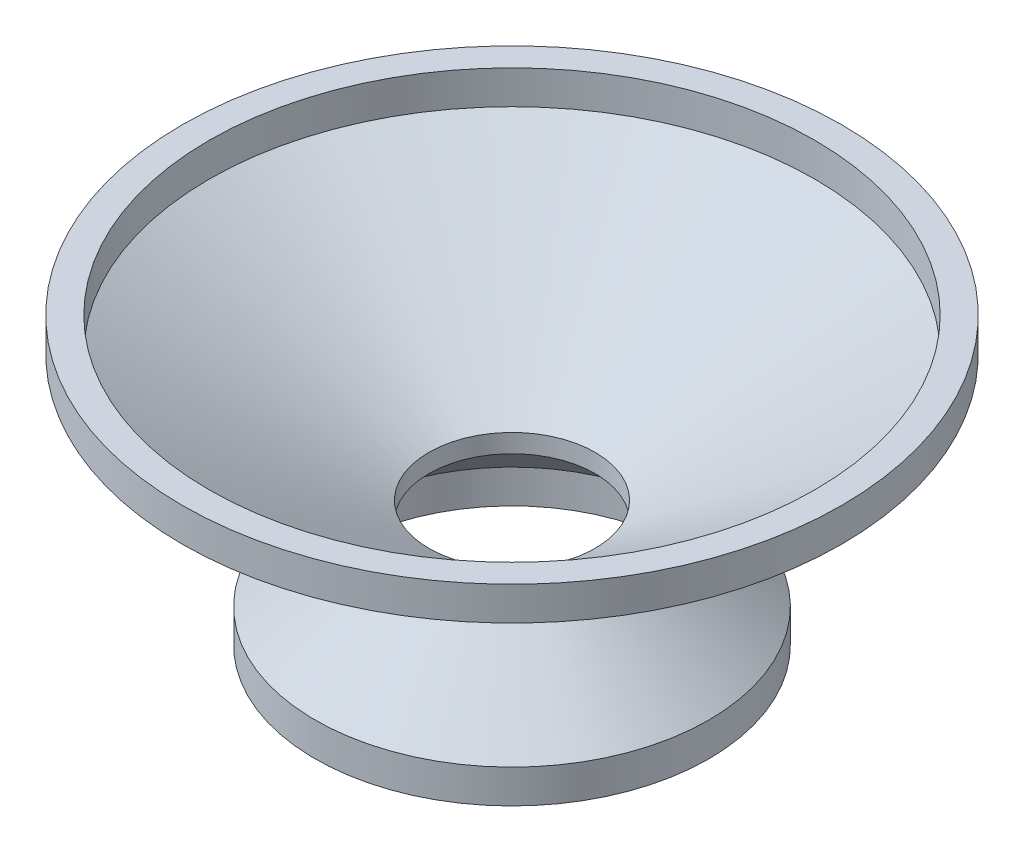
ISO-10303-21;
HEADER;
FILE_DESCRIPTION(('STEP AP214'),'2;1');
FILE_NAME('part.step','',(''),(''),'','','');
FILE_SCHEMA(('AUTOMOTIVE_DESIGN { 1 0 10303 214 1 1 1 1 }'));
ENDSEC;
DATA;
#1=APPLICATION_CONTEXT('core data for automotive mechanical design processes');
#2=APPLICATION_PROTOCOL_DEFINITION('international standard','automotive_design',2000,#1);
#3=PRODUCT_CONTEXT('',#1,'mechanical');
#4=PRODUCT('Part','Part','',(#3));
#5=PRODUCT_RELATED_PRODUCT_CATEGORY('part','',(#4));
#6=PRODUCT_DEFINITION_FORMATION('','',#4);
#7=PRODUCT_DEFINITION_CONTEXT('part definition',#1,'design');
#8=PRODUCT_DEFINITION('design','',#6,#7);
#9=PRODUCT_DEFINITION_SHAPE('','',#8);
#10=(LENGTH_UNIT() NAMED_UNIT(*) SI_UNIT(.MILLI.,.METRE.));
#11=(NAMED_UNIT(*) PLANE_ANGLE_UNIT() SI_UNIT($,.RADIAN.));
#12=(NAMED_UNIT(*) SI_UNIT($,.STERADIAN.) SOLID_ANGLE_UNIT());
#13=UNCERTAINTY_MEASURE_WITH_UNIT(LENGTH_MEASURE(1.E-05),#10,'distance_accuracy_value','');
#14=(GEOMETRIC_REPRESENTATION_CONTEXT(3) GLOBAL_UNCERTAINTY_ASSIGNED_CONTEXT((#13)) GLOBAL_UNIT_ASSIGNED_CONTEXT((#10,
#11,#12)) REPRESENTATION_CONTEXT('',''));
#15=CARTESIAN_POINT('',(0.,0.,0.));
#16=DIRECTION('',(0.,0.,1.));
#17=DIRECTION('',(1.,0.,0.));
#18=AXIS2_PLACEMENT_3D('',#15,#16,#17);
#19=CARTESIAN_POINT('',(6.40637549208277,0.,0.));
#20=DIRECTION('',(0.,-1.,0.));
#21=DIRECTION('',(1.,0.,0.));
#22=AXIS2_PLACEMENT_3D('',#19,#20,#21);
#23=CONICAL_SURFACE('',#22,5.7435935394488,0.872664625997171);
#24=CARTESIAN_POINT('',(6.40637549208277,-0.367198337412945,0.));
#25=DIRECTION('',(0.,-1.,0.));
#26=DIRECTION('',(1.,0.,0.));
#27=AXIS2_PLACEMENT_3D('',#24,#25,#26);
#28=CIRCLE('',#27,6.18120347725531);
#29=CARTESIAN_POINT('',(12.5875789693381,-0.367198337412944,0.));
#30=VERTEX_POINT('',#29);
#31=EDGE_CURVE('E10',#30,#30,#28,.T.);
#32=ORIENTED_EDGE('',*,*,#31,.T.);
#33=EDGE_LOOP('',(#32));
#34=FACE_BOUND('',#33,.T.);
#35=CARTESIAN_POINT('',(6.40637549208277,-5.,0.));
#36=DIRECTION('',(0.,-1.,0.));
#37=DIRECTION('',(1.,0.,0.));
#38=AXIS2_PLACEMENT_3D('',#35,#36,#37);
#39=CIRCLE('',#38,11.7023615024199);
#40=CARTESIAN_POINT('',(18.1087369945027,-5.,0.));
#41=VERTEX_POINT('',#40);
#42=EDGE_CURVE('E77',#41,#41,#39,.T.);
#43=ORIENTED_EDGE('',*,*,#42,.F.);
#44=EDGE_LOOP('',(#43));
#45=FACE_BOUND('',#44,.T.);
#46=ADVANCED_FACE('F41',(#34,#45),#23,.T.);
#47=CARTESIAN_POINT('',(6.40637549208277,8.,0.));
#48=DIRECTION('',(0.,1.,0.));
#49=DIRECTION('',(-1.,0.,0.));
#50=AXIS2_PLACEMENT_3D('',#47,#48,#49);
#51=CONICAL_SURFACE('',#50,19.6,1.0471975511966);
#52=CARTESIAN_POINT('',(6.40637549208277,0.285629601348427,0.));
#53=DIRECTION('',(0.,1.,0.));
#54=DIRECTION('',(-1.,0.,0.));
#55=AXIS2_PLACEMENT_3D('',#52,#53,#54);
#56=CIRCLE('',#55,6.23831852112992);
#57=CARTESIAN_POINT('',(0.168056970952842,0.285629601348427,0.));
#58=VERTEX_POINT('',#57);
#59=EDGE_CURVE('E48',#58,#58,#56,.T.);
#60=CARTESIAN_POINT('',(6.40637549208277,8.,0.));
#61=DIRECTION('',(0.,1.,0.));
#62=DIRECTION('',(-1.,0.,0.));
#63=AXIS2_PLACEMENT_3D('',#60,#61,#62);
#64=CIRCLE('',#63,19.6);
#65=CARTESIAN_POINT('',(-13.1936245079172,8.,0.));
#66=VERTEX_POINT('',#65);
#67=EDGE_CURVE('E52',#66,#66,#64,.T.);
#68=CARTESIAN_POINT('',(0.168056970952842,0.285629601348427,0.));
#69=CARTESIAN_POINT('',(0.0288727888812791,0.365987626334381,0.));
#70=CARTESIAN_POINT('',(-0.110311393190284,0.446345651320335,0.));
#71=CARTESIAN_POINT('',(-0.388679757333411,0.607061701292242,0.));
#72=CARTESIAN_POINT('',(-0.527863939404974,0.687419726278196,0.));
#73=CARTESIAN_POINT('',(-0.806232303548101,0.848135776250104,0.));
#74=CARTESIAN_POINT('',(-0.945416485619665,0.928493801236058,0.));
#75=CARTESIAN_POINT('',(-1.22378484976279,1.08920985120797,0.));
#76=CARTESIAN_POINT('',(-1.36296903183436,1.16956787619392,0.));
#77=CARTESIAN_POINT('',(-1.64133739597748,1.33028392616583,0.));
#78=CARTESIAN_POINT('',(-1.78052157804904,1.41064195115178,0.));
#79=CARTESIAN_POINT('',(-2.05888994219217,1.57135800112369,0.));
#80=CARTESIAN_POINT('',(-2.19807412426374,1.65171602610964,0.));
#81=CARTESIAN_POINT('',(-2.47644248840686,1.81243207608155,0.));
#82=CARTESIAN_POINT('',(-2.61562667047843,1.8927901010675,0.));
#83=CARTESIAN_POINT('',(-2.89399503462155,2.05350615103941,0.));
#84=CARTESIAN_POINT('',(-3.03317921669312,2.13386417602536,0.));
#85=CARTESIAN_POINT('',(-3.31154758083624,2.29458022599727,0.));
#86=CARTESIAN_POINT('',(-3.45073176290781,2.37493825098323,0.));
#87=CARTESIAN_POINT('',(-3.72910012705093,2.53565430095513,0.));
#88=CARTESIAN_POINT('',(-3.8682843091225,2.61601232594109,0.));
#89=CARTESIAN_POINT('',(-4.14665267326562,2.776728375913,0.));
#90=CARTESIAN_POINT('',(-4.28583685533719,2.85708640089895,0.));
#91=CARTESIAN_POINT('',(-4.56420521948031,3.01780245087086,0.));
#92=CARTESIAN_POINT('',(-4.70338940155188,3.09816047585681,0.));
#93=CARTESIAN_POINT('',(-4.981757765695,3.25887652582872,0.));
#94=CARTESIAN_POINT('',(-5.12094194776657,3.33923455081467,0.));
#95=CARTESIAN_POINT('',(-5.39931031190969,3.49995060078658,0.));
#96=CARTESIAN_POINT('',(-5.53849449398126,3.58030862577253,0.));
#97=CARTESIAN_POINT('',(-5.81686285812438,3.74102467574444,0.));
#98=CARTESIAN_POINT('',(-5.95604704019595,3.8213827007304,0.));
#99=CARTESIAN_POINT('',(-6.23441540433908,3.9820987507023,0.));
#100=CARTESIAN_POINT('',(-6.37359958641064,4.06245677568826,0.));
#101=CARTESIAN_POINT('',(-6.65196795055377,4.22317282566017,0.));
#102=CARTESIAN_POINT('',(-6.79115213262533,4.30353085064612,0.));
#103=CARTESIAN_POINT('',(-7.06952049676846,4.46424690061803,0.));
#104=CARTESIAN_POINT('',(-7.20870467884002,4.54460492560398,0.));
#105=CARTESIAN_POINT('',(-7.48707304298315,4.70532097557589,0.));
#106=CARTESIAN_POINT('',(-7.62625722505471,4.78567900056184,0.));
#107=CARTESIAN_POINT('',(-7.90462558919784,4.94639505053375,0.));
#108=CARTESIAN_POINT('',(-8.0438097712694,5.02675307551971,0.));
#109=CARTESIAN_POINT('',(-8.32217813541253,5.18746912549161,0.));
#110=CARTESIAN_POINT('',(-8.46136231748409,5.26782715047757,0.));
#111=CARTESIAN_POINT('',(-8.73973068162722,5.42854320044947,0.));
#112=CARTESIAN_POINT('',(-8.87891486369878,5.50890122543543,0.));
#113=CARTESIAN_POINT('',(-9.15728322784191,5.66961727540734,0.));
#114=CARTESIAN_POINT('',(-9.29646740991347,5.74997530039329,0.));
#115=CARTESIAN_POINT('',(-9.5748357740566,5.9106913503652,0.));
#116=CARTESIAN_POINT('',(-9.71401995612816,5.99104937535115,0.));
#117=CARTESIAN_POINT('',(-9.99238832027129,6.15176542532306,0.));
#118=CARTESIAN_POINT('',(-10.1315725023429,6.23212345030901,0.));
#119=CARTESIAN_POINT('',(-10.409940866486,6.39283950028092,0.));
#120=CARTESIAN_POINT('',(-10.5491250485575,6.47319752526688,0.));
#121=CARTESIAN_POINT('',(-10.8274934127007,6.63391357523878,0.));
#122=CARTESIAN_POINT('',(-10.9666775947722,6.71427160022474,0.));
#123=CARTESIAN_POINT('',(-11.2450459589154,6.87498765019664,0.));
#124=CARTESIAN_POINT('',(-11.3842301409869,6.9553456751826,0.));
#125=CARTESIAN_POINT('',(-11.66259850513,7.11606172515451,0.));
#126=CARTESIAN_POINT('',(-11.8017826872016,7.19641975014046,0.));
#127=CARTESIAN_POINT('',(-12.0801510513447,7.35713580011237,0.));
#128=CARTESIAN_POINT('',(-12.2193352334163,7.43749382509832,0.));
#129=CARTESIAN_POINT('',(-12.4977035975594,7.59820987507023,0.));
#130=CARTESIAN_POINT('',(-12.636887779631,7.67856790005618,0.));
#131=CARTESIAN_POINT('',(-12.9152561437741,7.83928395002809,0.));
#132=CARTESIAN_POINT('',(-13.0544403258457,7.91964197501404,0.));
#133=CARTESIAN_POINT('',(-13.1936245079172,8.,0.));
#134=B_SPLINE_CURVE_WITH_KNOTS('',3,(#68,#69,#70,#71,#72,#73,#74,#75,#76,#77,#78,#79,#80,#81,
#82,#83,#84,#85,#86,#87,#88,#89,#90,#91,#92,#93,#94,#95,#96,#97,#98,#99,#100,#101,#102,#103,
#104,#105,#106,#107,#108,#109,#110,#111,#112,#113,#114,#115,#116,#117,#118,#119,#120,#121,#122,
#123,#124,#125,#126,#127,#128,#129,#130,#131,#132,#133),.UNSPECIFIED.,.F.,.F.,(4,2,2,2,2,2,2,2,
2,2,2,2,2,2,2,2,2,2,2,2,2,2,2,2,2,2,2,2,2,2,2,2,4),(0.,0.482148149915728,0.964296299831456,
1.44644444974719,1.92859259966291,2.41074074957864,2.89288889949437,3.3750370494101,
3.85718519932583,4.33933334924156,4.82148149915728,5.30362964907301,5.78577779898874,
6.26792594890447,6.7500740988202,7.23222224873593,7.71437039865166,8.19651854856739,
8.67866669848311,9.16081484839884,9.64296299831457,10.1251111482303,10.607259298146,
11.0894074480618,11.5715555979775,12.0537037478932,12.5358518978089,13.0180000477247,
13.5001481976404,13.9822963475561,14.4644444974718,14.9465926473876,15.4287407973033),.UNSPECIFIED.);
#135=EDGE_CURVE('BSEAM106',#58,#66,#134,.T.);
#136=ORIENTED_EDGE('',*,*,#59,.T.);
#137=ORIENTED_EDGE('',*,*,#67,.F.);
#138=ORIENTED_EDGE('',*,*,#135,.T.);
#139=ORIENTED_EDGE('',*,*,#135,.F.);
#140=EDGE_LOOP('',(#136,#138,#137,#139));
#141=FACE_BOUND('',#140,.T.);
#142=ADVANCED_FACE('F106',(#141),#51,.T.);
#143=CARTESIAN_POINT('',(6.40637549208277,0.461880215351705,0.));
#144=DIRECTION('',(0.,1.,0.));
#145=DIRECTION('',(-1.,0.,0.));
#146=AXIS2_PLACEMENT_3D('',#143,#144,#145);
#147=CONICAL_SURFACE('',#146,4.9435935394488,1.0471975511966);
#148=CARTESIAN_POINT('',(6.40637549208277,8.,0.));
#149=DIRECTION('',(0.,1.,0.));
#150=DIRECTION('',(-1.,0.,0.));
#151=AXIS2_PLACEMENT_3D('',#148,#149,#150);
#152=CIRCLE('',#151,18.);
#153=CARTESIAN_POINT('',(-11.5936245079172,8.,0.));
#154=VERTEX_POINT('',#153);
#155=EDGE_CURVE('E71',#154,#154,#152,.T.);
#156=CARTESIAN_POINT('',(6.40637549208277,0.461880215351705,0.));
#157=DIRECTION('',(0.,1.,0.));
#158=DIRECTION('',(-1.,0.,0.));
#159=AXIS2_PLACEMENT_3D('',#156,#157,#158);
#160=CIRCLE('',#159,4.9435935394488);
#161=CARTESIAN_POINT('',(1.46278195263397,0.461880215351704,0.));
#162=VERTEX_POINT('',#161);
#163=EDGE_CURVE('E56',#162,#162,#160,.T.);
#164=CARTESIAN_POINT('',(-11.5936245079172,8.,0.));
#165=CARTESIAN_POINT('',(-11.4576202739532,7.92147791890991,0.));
#166=CARTESIAN_POINT('',(-11.3216160399891,7.84295583781983,0.));
#167=CARTESIAN_POINT('',(-11.0496075720609,7.68591167563965,0.));
#168=CARTESIAN_POINT('',(-10.9136033380969,7.60738959454957,0.));
#169=CARTESIAN_POINT('',(-10.6415948701687,7.45034543236939,0.));
#170=CARTESIAN_POINT('',(-10.5055906362046,7.37182335127931,0.));
#171=CARTESIAN_POINT('',(-10.2335821682765,7.21477918909913,0.));
#172=CARTESIAN_POINT('',(-10.0975779343124,7.13625710800905,0.));
#173=CARTESIAN_POINT('',(-9.82556946638426,6.97921294582888,0.));
#174=CARTESIAN_POINT('',(-9.68956523242018,6.90069086473879,0.));
#175=CARTESIAN_POINT('',(-9.41755676449203,6.74364670255862,0.));
#176=CARTESIAN_POINT('',(-9.28155253052796,6.66512462146853,0.));
#177=CARTESIAN_POINT('',(-9.00954406259981,6.50808045928836,0.));
#178=CARTESIAN_POINT('',(-8.87353982863573,6.42955837819827,0.));
#179=CARTESIAN_POINT('',(-8.60153136070758,6.2725142160181,0.));
#180=CARTESIAN_POINT('',(-8.46552712674351,6.19399213492801,0.));
#181=CARTESIAN_POINT('',(-8.19351865881536,6.03694797274784,0.));
#182=CARTESIAN_POINT('',(-8.05751442485128,5.95842589165775,0.));
#183=CARTESIAN_POINT('',(-7.78550595692313,5.80138172947758,0.));
#184=CARTESIAN_POINT('',(-7.64950172295906,5.72285964838749,0.));
#185=CARTESIAN_POINT('',(-7.37749325503091,5.56581548620732,0.));
#186=CARTESIAN_POINT('',(-7.24148902106683,5.48729340511724,0.));
#187=CARTESIAN_POINT('',(-6.96948055313868,5.33024924293706,0.));
#188=CARTESIAN_POINT('',(-6.83347631917461,5.25172716184698,0.));
#189=CARTESIAN_POINT('',(-6.56146785124646,5.0946829996668,0.));
#190=CARTESIAN_POINT('',(-6.42546361728238,5.01616091857672,0.));
#191=CARTESIAN_POINT('',(-6.15345514935423,4.85911675639654,0.));
#192=CARTESIAN_POINT('',(-6.01745091539016,4.78059467530646,0.));
#193=CARTESIAN_POINT('',(-5.74544244746201,4.62355051312628,0.));
#194=CARTESIAN_POINT('',(-5.60943821349793,4.5450284320362,0.));
#195=CARTESIAN_POINT('',(-5.33742974556978,4.38798426985602,0.));
#196=CARTESIAN_POINT('',(-5.20142551160571,4.30946218876594,0.));
#197=CARTESIAN_POINT('',(-4.92941704367756,4.15241802658577,0.));
#198=CARTESIAN_POINT('',(-4.79341280971348,4.07389594549568,0.));
#199=CARTESIAN_POINT('',(-4.52140434178533,3.91685178331551,0.));
#200=CARTESIAN_POINT('',(-4.38540010782126,3.83832970222542,0.));
#201=CARTESIAN_POINT('',(-4.11339163989311,3.68128554004525,0.));
#202=CARTESIAN_POINT('',(-3.97738740592903,3.60276345895516,0.));
#203=CARTESIAN_POINT('',(-3.70537893800088,3.44571929677499,0.));
#204=CARTESIAN_POINT('',(-3.56937470403681,3.3671972156849,0.));
#205=CARTESIAN_POINT('',(-3.29736623610866,3.21015305350473,0.));
#206=CARTESIAN_POINT('',(-3.16136200214458,3.13163097241464,0.));
#207=CARTESIAN_POINT('',(-2.88935353421643,2.97458681023447,0.));
#208=CARTESIAN_POINT('',(-2.75334930025236,2.89606472914438,0.));
#209=CARTESIAN_POINT('',(-2.48134083232421,2.73902056696421,0.));
#210=CARTESIAN_POINT('',(-2.34533659836013,2.66049848587412,0.));
#211=CARTESIAN_POINT('',(-2.07332813043198,2.50345432369395,0.));
#212=CARTESIAN_POINT('',(-1.93732389646791,2.42493224260386,0.));
#213=CARTESIAN_POINT('',(-1.66531542853976,2.26788808042369,0.));
#214=CARTESIAN_POINT('',(-1.52931119457568,2.18936599933361,0.));
#215=CARTESIAN_POINT('',(-1.25730272664753,2.03232183715343,0.));
#216=CARTESIAN_POINT('',(-1.12129849268346,1.95379975606335,0.));
#217=CARTESIAN_POINT('',(-0.849290024755308,1.79675559388317,0.));
#218=CARTESIAN_POINT('',(-0.713285790791233,1.71823351279309,0.));
#219=CARTESIAN_POINT('',(-0.441277322863083,1.56118935061291,0.));
#220=CARTESIAN_POINT('',(-0.305273088899009,1.48266726952283,0.));
#221=CARTESIAN_POINT('',(-0.0332646209708589,1.32562310734266,0.));
#222=CARTESIAN_POINT('',(0.102739612993216,1.24710102625257,0.));
#223=CARTESIAN_POINT('',(0.374748080921366,1.0900568640724,0.));
#224=CARTESIAN_POINT('',(0.510752314885441,1.01153478298231,0.));
#225=CARTESIAN_POINT('',(0.782760782813591,0.854490620802136,0.));
#226=CARTESIAN_POINT('',(0.918765016777666,0.77596853971205,0.));
#227=CARTESIAN_POINT('',(1.19077348470582,0.618924377531877,0.));
#228=CARTESIAN_POINT('',(1.32677771866989,0.540402296441791,0.));
#229=CARTESIAN_POINT('',(1.46278195263397,0.461880215351704,0.));
#230=B_SPLINE_CURVE_WITH_KNOTS('',3,(#164,#165,#166,#167,#168,#169,#170,#171,#172,#173,#174,
#175,#176,#177,#178,#179,#180,#181,#182,#183,#184,#185,#186,#187,#188,#189,#190,#191,#192,#193,
#194,#195,#196,#197,#198,#199,#200,#201,#202,#203,#204,#205,#206,#207,#208,#209,#210,#211,#212,
#213,#214,#215,#216,#217,#218,#219,#220,#221,#222,#223,#224,#225,#226,#227,#228,#229),
.UNSPECIFIED.,.F.,.F.,(4,2,2,2,2,2,2,2,2,2,2,2,2,2,2,2,2,2,2,2,2,2,2,2,2,2,2,2,2,2,2,2,4),(0.,
0.471132486540523,0.942264973081049,1.41339745962157,1.8845299461621,2.35566243270262,
2.82679491924314,3.29792740578367,3.76905989232419,4.24019237886471,4.71132486540524,
5.18245735194576,5.65358983848628,6.12472232502681,6.59585481156733,7.06698729810785,
7.53811978464838,8.0092522711889,8.48038475772942,8.95151724426995,9.42264973081047,
9.89378221735099,10.3649147038915,10.836047190432,11.3071796769726,11.7783121635131,
12.2494446500536,12.7205771365941,13.1917096231347,13.6628421096752,14.1339745962157,
14.6051070827562,15.0762395692968),.UNSPECIFIED.);
#231=EDGE_CURVE('BSEAM111',#154,#162,#230,.T.);
#232=ORIENTED_EDGE('',*,*,#155,.T.);
#233=ORIENTED_EDGE('',*,*,#163,.F.);
#234=ORIENTED_EDGE('',*,*,#231,.T.);
#235=ORIENTED_EDGE('',*,*,#231,.F.);
#236=EDGE_LOOP('',(#232,#234,#233,#235));
#237=FACE_BOUND('',#236,.T.);
#238=ADVANCED_FACE('F111',(#237),#147,.F.);
#239=CARTESIAN_POINT('',(6.40637549208277,7.60901803281973,0.));
#240=DIRECTION('',(0.,1.,0.));
#241=DIRECTION('',(-1.,0.,0.));
#242=AXIS2_PLACEMENT_3D('',#239,#240,#241);
#243=CYLINDRICAL_SURFACE('',#242,4.9435935394488);
#244=ORIENTED_EDGE('',*,*,#163,.T.);
#245=EDGE_LOOP('',(#244));
#246=FACE_BOUND('',#245,.T.);
#247=CARTESIAN_POINT('',(6.40637549208277,-0.634127584390456,0.));
#248=DIRECTION('',(0.,1.,0.));
#249=DIRECTION('',(-1.,0.,0.));
#250=AXIS2_PLACEMENT_3D('',#247,#248,#249);
#251=CIRCLE('',#250,4.9435935394488);
#252=CARTESIAN_POINT('',(1.46278195263397,-0.634127584390457,0.));
#253=VERTEX_POINT('',#252);
#254=EDGE_CURVE('E61',#253,#253,#251,.T.);
#255=ORIENTED_EDGE('',*,*,#254,.F.);
#256=EDGE_LOOP('',(#255));
#257=FACE_BOUND('',#256,.T.);
#258=ADVANCED_FACE('F117',(#246,#257),#243,.F.);
#259=CARTESIAN_POINT('',(6.40637549208277,-5.,0.));
#260=DIRECTION('',(0.,-1.,0.));
#261=DIRECTION('',(1.,0.,0.));
#262=AXIS2_PLACEMENT_3D('',#259,#260,#261);
#263=CONICAL_SURFACE('',#262,10.1466376755595,0.872664625997171);
#264=ORIENTED_EDGE('',*,*,#254,.T.);
#265=EDGE_LOOP('',(#264));
#266=FACE_BOUND('',#265,.T.);
#267=CARTESIAN_POINT('',(6.40637549208277,-5.,0.));
#268=DIRECTION('',(0.,1.,0.));
#269=DIRECTION('',(-1.,0.,0.));
#270=AXIS2_PLACEMENT_3D('',#267,#268,#269);
#271=CIRCLE('',#270,10.1466376755595);
#272=CARTESIAN_POINT('',(-3.74026218347673,-5.,0.));
#273=VERTEX_POINT('',#272);
#274=EDGE_CURVE('E64',#273,#273,#271,.T.);
#275=ORIENTED_EDGE('',*,*,#274,.F.);
#276=EDGE_LOOP('',(#275));
#277=FACE_BOUND('',#276,.T.);
#278=ADVANCED_FACE('F121',(#266,#277),#263,.F.);
#279=CARTESIAN_POINT('',(6.40637549208277,-0.0607805601653515,0.));
#280=DIRECTION('',(0.,1.,0.));
#281=DIRECTION('',(-1.,0.,0.));
#282=AXIS2_PLACEMENT_3D('',#279,#280,#281);
#283=TOROIDAL_SURFACE('',#282,6.43831852112992,0.4);
#284=ORIENTED_EDGE('',*,*,#31,.F.);
#285=EDGE_LOOP('',(#284));
#286=FACE_BOUND('',#285,.T.);
#287=ORIENTED_EDGE('',*,*,#59,.F.);
#288=EDGE_LOOP('',(#287));
#289=FACE_BOUND('',#288,.T.);
#290=ADVANCED_FACE('F43',(#286,#289),#283,.F.);
#291=CARTESIAN_POINT('',(6.40637549208277,10.,0.));
#292=DIRECTION('',(0.,1.,0.));
#293=DIRECTION('',(-1.,0.,0.));
#294=AXIS2_PLACEMENT_3D('',#291,#292,#293);
#295=PLANE('',#294);
#296=CARTESIAN_POINT('',(6.40637549208277,10.,0.));
#297=DIRECTION('',(0.,1.,0.));
#298=DIRECTION('',(-1.,0.,0.));
#299=AXIS2_PLACEMENT_3D('',#296,#297,#298);
#300=CIRCLE('',#299,19.6);
#301=CARTESIAN_POINT('',(-13.1936245079172,10.,0.));
#302=VERTEX_POINT('',#301);
#303=EDGE_CURVE('E67',#302,#302,#300,.T.);
#304=ORIENTED_EDGE('',*,*,#303,.T.);
#305=EDGE_LOOP('',(#304));
#306=FACE_BOUND('',#305,.T.);
#307=CARTESIAN_POINT('',(6.40637549208277,10.,0.));
#308=DIRECTION('',(0.,1.,0.));
#309=DIRECTION('',(-1.,0.,0.));
#310=AXIS2_PLACEMENT_3D('',#307,#308,#309);
#311=CIRCLE('',#310,18.);
#312=CARTESIAN_POINT('',(-11.5936245079172,10.,0.));
#313=VERTEX_POINT('',#312);
#314=EDGE_CURVE('E70',#313,#313,#311,.T.);
#315=ORIENTED_EDGE('',*,*,#314,.F.);
#316=EDGE_LOOP('',(#315));
#317=FACE_BOUND('',#316,.T.);
#318=ADVANCED_FACE('F127',(#306,#317),#295,.T.);
#319=CARTESIAN_POINT('',(6.40637549208277,10.,0.));
#320=DIRECTION('',(0.,-1.,0.));
#321=DIRECTION('',(1.,0.,0.));
#322=AXIS2_PLACEMENT_3D('',#319,#320,#321);
#323=CYLINDRICAL_SURFACE('',#322,19.6);
#324=ORIENTED_EDGE('',*,*,#303,.F.);
#325=EDGE_LOOP('',(#324));
#326=FACE_BOUND('',#325,.T.);
#327=ORIENTED_EDGE('',*,*,#67,.T.);
#328=EDGE_LOOP('',(#327));
#329=FACE_BOUND('',#328,.T.);
#330=ADVANCED_FACE('F101',(#326,#329),#323,.T.);
#331=CARTESIAN_POINT('',(6.40637549208277,10.,0.));
#332=DIRECTION('',(0.,-1.,0.));
#333=DIRECTION('',(1.,0.,0.));
#334=AXIS2_PLACEMENT_3D('',#331,#332,#333);
#335=CYLINDRICAL_SURFACE('',#334,18.);
#336=ORIENTED_EDGE('',*,*,#314,.T.);
#337=EDGE_LOOP('',(#336));
#338=FACE_BOUND('',#337,.T.);
#339=ORIENTED_EDGE('',*,*,#155,.F.);
#340=EDGE_LOOP('',(#339));
#341=FACE_BOUND('',#340,.T.);
#342=ADVANCED_FACE('F92',(#338,#341),#335,.F.);
#343=CARTESIAN_POINT('',(6.40637549208277,-6.99999999999999,0.));
#344=DIRECTION('',(0.,-1.,0.));
#345=DIRECTION('',(1.,0.,0.));
#346=AXIS2_PLACEMENT_3D('',#343,#344,#345);
#347=PLANE('',#346);
#348=CARTESIAN_POINT('',(6.40637549208277,-6.99999999999999,0.));
#349=DIRECTION('',(0.,-1.,0.));
#350=DIRECTION('',(1.,0.,0.));
#351=AXIS2_PLACEMENT_3D('',#348,#349,#350);
#352=CIRCLE('',#351,11.7023615024199);
#353=CARTESIAN_POINT('',(18.1087369945027,-6.99999999999999,0.));
#354=VERTEX_POINT('',#353);
#355=EDGE_CURVE('E74',#354,#354,#352,.T.);
#356=ORIENTED_EDGE('',*,*,#355,.T.);
#357=EDGE_LOOP('',(#356));
#358=FACE_BOUND('',#357,.T.);
#359=CARTESIAN_POINT('',(6.40637549208277,-6.99999999999999,0.));
#360=DIRECTION('',(0.,-1.,0.));
#361=DIRECTION('',(1.,0.,0.));
#362=AXIS2_PLACEMENT_3D('',#359,#360,#361);
#363=CIRCLE('',#362,10.1466376755595);
#364=CARTESIAN_POINT('',(16.5530131676423,-6.99999999999999,0.));
#365=VERTEX_POINT('',#364);
#366=EDGE_CURVE('E80',#365,#365,#363,.T.);
#367=ORIENTED_EDGE('',*,*,#366,.F.);
#368=EDGE_LOOP('',(#367));
#369=FACE_BOUND('',#368,.T.);
#370=ADVANCED_FACE('F89',(#358,#369),#347,.T.);
#371=CARTESIAN_POINT('',(6.40637549208277,-6.99999999999999,0.));
#372=DIRECTION('',(0.,1.,0.));
#373=DIRECTION('',(-1.,0.,0.));
#374=AXIS2_PLACEMENT_3D('',#371,#372,#373);
#375=CYLINDRICAL_SURFACE('',#374,11.7023615024199);
#376=ORIENTED_EDGE('',*,*,#355,.F.);
#377=EDGE_LOOP('',(#376));
#378=FACE_BOUND('',#377,.T.);
#379=ORIENTED_EDGE('',*,*,#42,.T.);
#380=EDGE_LOOP('',(#379));
#381=FACE_BOUND('',#380,.T.);
#382=ADVANCED_FACE('F91',(#378,#381),#375,.T.);
#383=CARTESIAN_POINT('',(6.40637549208277,-6.99999999999999,0.));
#384=DIRECTION('',(0.,1.,0.));
#385=DIRECTION('',(-1.,0.,0.));
#386=AXIS2_PLACEMENT_3D('',#383,#384,#385);
#387=CYLINDRICAL_SURFACE('',#386,10.1466376755595);
#388=ORIENTED_EDGE('',*,*,#366,.T.);
#389=EDGE_LOOP('',(#388));
#390=FACE_BOUND('',#389,.T.);
#391=ORIENTED_EDGE('',*,*,#274,.T.);
#392=EDGE_LOOP('',(#391));
#393=FACE_BOUND('',#392,.T.);
#394=ADVANCED_FACE('F86',(#390,#393),#387,.F.);
#395=CLOSED_SHELL('',(#46,#142,#238,#258,#278,#290,#318,#330,#342,#370,#382,#394));
#396=MANIFOLD_SOLID_BREP('B2',#395);
#397=ADVANCED_BREP_SHAPE_REPRESENTATION('',(#18,#396),#14);
#398=SHAPE_DEFINITION_REPRESENTATION(#9,#397);
ENDSEC;
END-ISO-10303-21;
